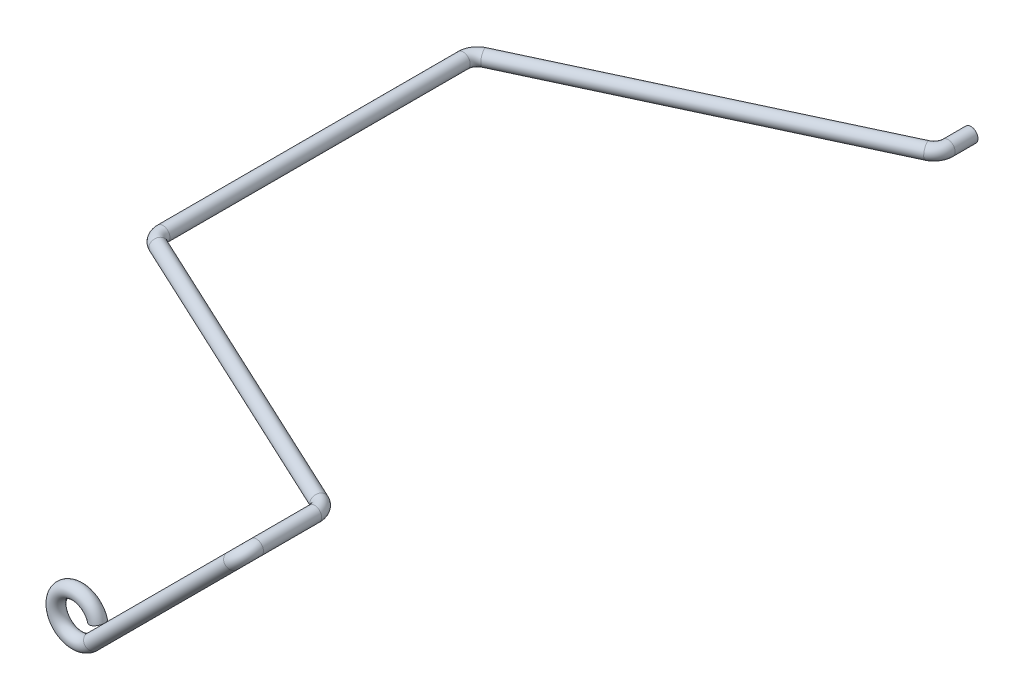
ISO-10303-21;
HEADER;
FILE_DESCRIPTION(('STEP AP214'),'2;1');
FILE_NAME('part.step','',(''),(''),'','','');
FILE_SCHEMA(('AUTOMOTIVE_DESIGN { 1 0 10303 214 1 1 1 1 }'));
ENDSEC;
DATA;
#1=APPLICATION_CONTEXT('core data for automotive mechanical design processes');
#2=APPLICATION_PROTOCOL_DEFINITION('international standard','automotive_design',2000,#1);
#3=PRODUCT_CONTEXT('',#1,'mechanical');
#4=PRODUCT('Part','Part','',(#3));
#5=PRODUCT_RELATED_PRODUCT_CATEGORY('part','',(#4));
#6=PRODUCT_DEFINITION_FORMATION('','',#4);
#7=PRODUCT_DEFINITION_CONTEXT('part definition',#1,'design');
#8=PRODUCT_DEFINITION('design','',#6,#7);
#9=PRODUCT_DEFINITION_SHAPE('','',#8);
#10=(LENGTH_UNIT() NAMED_UNIT(*) SI_UNIT(.MILLI.,.METRE.));
#11=(NAMED_UNIT(*) PLANE_ANGLE_UNIT() SI_UNIT($,.RADIAN.));
#12=(NAMED_UNIT(*) SI_UNIT($,.STERADIAN.) SOLID_ANGLE_UNIT());
#13=UNCERTAINTY_MEASURE_WITH_UNIT(LENGTH_MEASURE(1.E-05),#10,'distance_accuracy_value','');
#14=(GEOMETRIC_REPRESENTATION_CONTEXT(3) GLOBAL_UNCERTAINTY_ASSIGNED_CONTEXT((#13)) GLOBAL_UNIT_ASSIGNED_CONTEXT((#10,
#11,#12)) REPRESENTATION_CONTEXT('',''));
#15=CARTESIAN_POINT('',(0.,0.,0.));
#16=DIRECTION('',(0.,0.,1.));
#17=DIRECTION('',(1.,0.,0.));
#18=AXIS2_PLACEMENT_3D('',#15,#16,#17);
#19=CARTESIAN_POINT('',(-23.334523779156,-19.0918830920372,103.));
#20=DIRECTION('',(0.,0.,-1.));
#21=DIRECTION('',(-1.,0.,0.));
#22=AXIS2_PLACEMENT_3D('',#19,#20,#21);
#23=TOROIDAL_SURFACE('',#22,2.9999999999999,1.);
#24=CARTESIAN_POINT('',(-21.2132034355965,-21.2132034355968,103.));
#25=DIRECTION('',(-0.707106781186561,-0.707106781186534,0.));
#26=DIRECTION('',(0.49999999999999,-0.500000000000013,0.707106781186546));
#27=AXIS2_PLACEMENT_3D('',#24,#25,#26);
#28=CIRCLE('',#27,1.);
#29=CARTESIAN_POINT('',(-20.50609665441,-21.9203102167833,103.));
#30=VERTEX_POINT('',#29);
#31=EDGE_CURVE('E37',#30,#30,#28,.T.);
#32=CARTESIAN_POINT('',(-20.436746300289,-18.3154259567292,103.));
#33=DIRECTION('',(0.258819045102662,-0.96592582628903,0.));
#34=DIRECTION('',(0.683012701892195,0.183012701892317,0.707106781186546));
#35=AXIS2_PLACEMENT_3D('',#32,#33,#34);
#36=CIRCLE('',#35,1.);
#37=CARTESIAN_POINT('',(-19.470820474,-18.0566069116266,103.));
#38=VERTEX_POINT('',#37);
#39=EDGE_CURVE('E10',#38,#38,#36,.T.);
#40=CARTESIAN_POINT('',(-23.334523779156,-19.0918830920372,103.));
#41=DIRECTION('',(0.,0.,-1.));
#42=DIRECTION('',(-1.,0.,0.));
#43=AXIS2_PLACEMENT_3D('',#40,#41,#42);
#44=CIRCLE('',#43,3.9999999999999);
#45=EDGE_CURVE('',#30,#38,#44,.T.);
#46=ORIENTED_EDGE('',*,*,#31,.T.);
#47=ORIENTED_EDGE('',*,*,#39,.F.);
#48=ORIENTED_EDGE('',*,*,#45,.T.);
#49=ORIENTED_EDGE('',*,*,#45,.F.);
#50=EDGE_LOOP('',(#46,#48,#47,#49));
#51=FACE_BOUND('',#50,.T.);
#52=ADVANCED_FACE('F31',(#51),#23,.T.);
#53=CARTESIAN_POINT('',(-1.41421356237319,-1.41421356237305,103.));
#54=DIRECTION('',(-0.70710678118654,-0.707106781186555,0.));
#55=DIRECTION('',(0.707106781186555,-0.70710678118654,0.));
#56=AXIS2_PLACEMENT_3D('',#53,#54,#55);
#57=CYLINDRICAL_SURFACE('',#56,1.);
#58=CARTESIAN_POINT('',(-1.41421356237319,-1.41421356237305,103.));
#59=DIRECTION('',(-0.707106781186561,-0.707106781186534,0.));
#60=DIRECTION('',(0.49999999999999,-0.500000000000013,0.707106781186546));
#61=AXIS2_PLACEMENT_3D('',#58,#59,#60);
#62=CIRCLE('',#61,1.);
#63=CARTESIAN_POINT('',(-1.41421356237319,-1.41421356237307,104.));
#64=VERTEX_POINT('',#63);
#65=EDGE_CURVE('E41',#64,#64,#62,.T.);
#66=ORIENTED_EDGE('',*,*,#65,.T.);
#67=EDGE_LOOP('',(#66));
#68=FACE_BOUND('',#67,.T.);
#69=ORIENTED_EDGE('',*,*,#31,.F.);
#70=EDGE_LOOP('',(#69));
#71=FACE_BOUND('',#70,.T.);
#72=ADVANCED_FACE('F96',(#68,#71),#57,.T.);
#73=CARTESIAN_POINT('',(-1.41421356237318,-1.41421356237301,101.));
#74=DIRECTION('',(0.707106781186544,-0.707106781186551,0.));
#75=DIRECTION('',(0.707106781186551,0.707106781186544,0.));
#76=AXIS2_PLACEMENT_3D('',#73,#74,#75);
#77=TOROIDAL_SURFACE('',#76,2.00000000000012,1.);
#78=CARTESIAN_POINT('',(0.,1.63658069083023E-13,101.));
#79=DIRECTION('',(0.,0.,1.));
#80=DIRECTION('',(1.,0.,0.));
#81=AXIS2_PLACEMENT_3D('',#78,#79,#80);
#82=CIRCLE('',#81,1.);
#83=CARTESIAN_POINT('',(0.707106781186553,0.707106781186707,101.));
#84=VERTEX_POINT('',#83);
#85=EDGE_CURVE('E45',#84,#84,#82,.T.);
#86=CARTESIAN_POINT('',(-1.41421356237318,-1.41421356237301,101.));
#87=DIRECTION('',(0.707106781186544,-0.707106781186551,0.));
#88=DIRECTION('',(0.707106781186551,0.707106781186544,0.));
#89=AXIS2_PLACEMENT_3D('',#86,#87,#88);
#90=CIRCLE('',#89,3.00000000000012);
#91=EDGE_CURVE('',#84,#64,#90,.T.);
#92=ORIENTED_EDGE('',*,*,#85,.T.);
#93=ORIENTED_EDGE('',*,*,#65,.F.);
#94=ORIENTED_EDGE('',*,*,#91,.T.);
#95=ORIENTED_EDGE('',*,*,#91,.F.);
#96=EDGE_LOOP('',(#92,#94,#93,#95));
#97=FACE_BOUND('',#96,.T.);
#98=ADVANCED_FACE('F100',(#97),#77,.T.);
#99=CARTESIAN_POINT('',(0.,0.,92.7737260476329));
#100=DIRECTION('',(0.,0.,1.));
#101=DIRECTION('',(0.,-1.,0.));
#102=AXIS2_PLACEMENT_3D('',#99,#100,#101);
#103=CYLINDRICAL_SURFACE('',#102,1.);
#104=CARTESIAN_POINT('',(0.,0.,92.7737260476329));
#105=DIRECTION('',(0.,0.,1.));
#106=DIRECTION('',(1.,0.,0.));
#107=AXIS2_PLACEMENT_3D('',#104,#105,#106);
#108=CIRCLE('',#107,1.);
#109=CARTESIAN_POINT('',(1.,0.,92.7737260476329));
#110=VERTEX_POINT('',#109);
#111=EDGE_CURVE('E50',#110,#110,#108,.T.);
#112=ORIENTED_EDGE('',*,*,#111,.T.);
#113=EDGE_LOOP('',(#112));
#114=FACE_BOUND('',#113,.T.);
#115=ORIENTED_EDGE('',*,*,#85,.F.);
#116=EDGE_LOOP('',(#115));
#117=FACE_BOUND('',#116,.T.);
#118=ADVANCED_FACE('F106',(#114,#117),#103,.T.);
#119=CARTESIAN_POINT('',(-2.,0.,92.7737260476329));
#120=DIRECTION('',(0.,-1.,0.));
#121=DIRECTION('',(0.,0.,-1.));
#122=AXIS2_PLACEMENT_3D('',#119,#120,#121);
#123=TOROIDAL_SURFACE('',#122,2.,1.);
#124=CARTESIAN_POINT('',(-1.15422906933774,0.,90.9613597676424));
#125=DIRECTION('',(0.906183139995262,0.,0.422885465331132));
#126=DIRECTION('',(0.422885465331132,0.,-0.906183139995262));
#127=AXIS2_PLACEMENT_3D('',#124,#125,#126);
#128=CIRCLE('',#127,1.);
#129=CARTESIAN_POINT('',(-0.731343604006615,0.,90.0551766276471));
#130=VERTEX_POINT('',#129);
#131=EDGE_CURVE('E53',#130,#130,#128,.T.);
#132=CARTESIAN_POINT('',(-2.,0.,92.7737260476329));
#133=DIRECTION('',(0.,-1.,0.));
#134=DIRECTION('',(0.,0.,-1.));
#135=AXIS2_PLACEMENT_3D('',#132,#133,#134);
#136=CIRCLE('',#135,3.);
#137=EDGE_CURVE('',#130,#110,#136,.T.);
#138=ORIENTED_EDGE('',*,*,#131,.T.);
#139=ORIENTED_EDGE('',*,*,#111,.F.);
#140=ORIENTED_EDGE('',*,*,#137,.T.);
#141=ORIENTED_EDGE('',*,*,#137,.F.);
#142=EDGE_LOOP('',(#138,#140,#139,#141));
#143=FACE_BOUND('',#142,.T.);
#144=ADVANCED_FACE('F113',(#143),#123,.T.);
#145=CARTESIAN_POINT('',(-43.8457709306622,0.,71.0386402323576));
#146=DIRECTION('',(0.906183139995265,0.,0.422885465331124));
#147=DIRECTION('',(0.422885465331124,0.,-0.906183139995265));
#148=AXIS2_PLACEMENT_3D('',#145,#146,#147);
#149=CYLINDRICAL_SURFACE('',#148,1.);
#150=CARTESIAN_POINT('',(-43.8457709306622,0.,71.0386402323576));
#151=DIRECTION('',(0.906183139995262,0.,0.422885465331132));
#152=DIRECTION('',(0.422885465331132,0.,-0.906183139995262));
#153=AXIS2_PLACEMENT_3D('',#150,#151,#152);
#154=CIRCLE('',#153,1.);
#155=CARTESIAN_POINT('',(-44.2686563959934,0.,71.9448233723529));
#156=VERTEX_POINT('',#155);
#157=EDGE_CURVE('E56',#156,#156,#154,.T.);
#158=ORIENTED_EDGE('',*,*,#157,.T.);
#159=EDGE_LOOP('',(#158));
#160=FACE_BOUND('',#159,.T.);
#161=ORIENTED_EDGE('',*,*,#131,.F.);
#162=EDGE_LOOP('',(#161));
#163=FACE_BOUND('',#162,.T.);
#164=ADVANCED_FACE('F117',(#160,#163),#149,.T.);
#165=CARTESIAN_POINT('',(-43.,0.,69.2262739523671));
#166=DIRECTION('',(0.,1.,0.));
#167=DIRECTION('',(0.,0.,1.));
#168=AXIS2_PLACEMENT_3D('',#165,#166,#167);
#169=TOROIDAL_SURFACE('',#168,2.00000000000001,1.);
#170=CARTESIAN_POINT('',(-45.,0.,69.2262739523671));
#171=DIRECTION('',(0.,0.,1.));
#172=DIRECTION('',(1.,0.,0.));
#173=AXIS2_PLACEMENT_3D('',#170,#171,#172);
#174=CIRCLE('',#173,1.);
#175=CARTESIAN_POINT('',(-46.,0.,69.2262739523671));
#176=VERTEX_POINT('',#175);
#177=EDGE_CURVE('E59',#176,#176,#174,.T.);
#178=CARTESIAN_POINT('',(-43.,0.,69.2262739523671));
#179=DIRECTION('',(0.,1.,0.));
#180=DIRECTION('',(0.,0.,1.));
#181=AXIS2_PLACEMENT_3D('',#178,#179,#180);
#182=CIRCLE('',#181,3.00000000000001);
#183=EDGE_CURVE('',#176,#156,#182,.T.);
#184=ORIENTED_EDGE('',*,*,#177,.T.);
#185=ORIENTED_EDGE('',*,*,#157,.F.);
#186=ORIENTED_EDGE('',*,*,#183,.T.);
#187=ORIENTED_EDGE('',*,*,#183,.F.);
#188=EDGE_LOOP('',(#184,#186,#185,#187));
#189=FACE_BOUND('',#188,.T.);
#190=ADVANCED_FACE('F121',(#189),#169,.T.);
#191=CARTESIAN_POINT('',(-45.,0.,26.7737260476329));
#192=DIRECTION('',(0.,0.,1.));
#193=DIRECTION('',(1.,0.,0.));
#194=AXIS2_PLACEMENT_3D('',#191,#192,#193);
#195=CYLINDRICAL_SURFACE('',#194,1.);
#196=CARTESIAN_POINT('',(-45.,0.,26.7737260476329));
#197=DIRECTION('',(0.,0.,1.));
#198=DIRECTION('',(1.,0.,0.));
#199=AXIS2_PLACEMENT_3D('',#196,#197,#198);
#200=CIRCLE('',#199,1.);
#201=CARTESIAN_POINT('',(-46.,0.,26.7737260476329));
#202=VERTEX_POINT('',#201);
#203=EDGE_CURVE('E62',#202,#202,#200,.T.);
#204=ORIENTED_EDGE('',*,*,#203,.T.);
#205=EDGE_LOOP('',(#204));
#206=FACE_BOUND('',#205,.T.);
#207=ORIENTED_EDGE('',*,*,#177,.F.);
#208=EDGE_LOOP('',(#207));
#209=FACE_BOUND('',#208,.T.);
#210=ADVANCED_FACE('F125',(#206,#209),#195,.T.);
#211=CARTESIAN_POINT('',(-43.,0.,26.7737260476329));
#212=DIRECTION('',(0.,1.,0.));
#213=DIRECTION('',(0.,0.,1.));
#214=AXIS2_PLACEMENT_3D('',#211,#212,#213);
#215=TOROIDAL_SURFACE('',#214,2.,1.);
#216=CARTESIAN_POINT('',(-43.8457709306623,0.,24.9613597676424));
#217=DIRECTION('',(-0.906183139995265,0.,0.422885465331124));
#218=DIRECTION('',(0.422885465331124,0.,0.906183139995265));
#219=AXIS2_PLACEMENT_3D('',#216,#217,#218);
#220=CIRCLE('',#219,1.);
#221=CARTESIAN_POINT('',(-44.2686563959934,0.,24.0551766276471));
#222=VERTEX_POINT('',#221);
#223=EDGE_CURVE('E65',#222,#222,#220,.T.);
#224=CARTESIAN_POINT('',(-43.,0.,26.7737260476329));
#225=DIRECTION('',(0.,1.,0.));
#226=DIRECTION('',(0.,0.,1.));
#227=AXIS2_PLACEMENT_3D('',#224,#225,#226);
#228=CIRCLE('',#227,3.);
#229=EDGE_CURVE('',#222,#202,#228,.T.);
#230=ORIENTED_EDGE('',*,*,#223,.T.);
#231=ORIENTED_EDGE('',*,*,#203,.F.);
#232=ORIENTED_EDGE('',*,*,#229,.T.);
#233=ORIENTED_EDGE('',*,*,#229,.F.);
#234=EDGE_LOOP('',(#230,#232,#231,#233));
#235=FACE_BOUND('',#234,.T.);
#236=ADVANCED_FACE('F129',(#235),#215,.T.);
#237=CARTESIAN_POINT('',(-1.15422906933775,0.,5.03864023235763));
#238=DIRECTION('',(-0.906183139995266,0.,0.422885465331124));
#239=DIRECTION('',(0.422885465331124,0.,0.906183139995266));
#240=AXIS2_PLACEMENT_3D('',#237,#238,#239);
#241=CYLINDRICAL_SURFACE('',#240,1.);
#242=CARTESIAN_POINT('',(-1.15422906933775,0.,5.03864023235763));
#243=DIRECTION('',(-0.906183139995265,0.,0.422885465331124));
#244=DIRECTION('',(0.422885465331124,0.,0.906183139995265));
#245=AXIS2_PLACEMENT_3D('',#242,#243,#244);
#246=CIRCLE('',#245,1.);
#247=CARTESIAN_POINT('',(-0.731343604006628,0.,5.9448233723529));
#248=VERTEX_POINT('',#247);
#249=EDGE_CURVE('E68',#248,#248,#246,.T.);
#250=ORIENTED_EDGE('',*,*,#249,.T.);
#251=EDGE_LOOP('',(#250));
#252=FACE_BOUND('',#251,.T.);
#253=ORIENTED_EDGE('',*,*,#223,.F.);
#254=EDGE_LOOP('',(#253));
#255=FACE_BOUND('',#254,.T.);
#256=ADVANCED_FACE('F133',(#252,#255),#241,.T.);
#257=CARTESIAN_POINT('',(-2.,0.,3.2262739523671));
#258=DIRECTION('',(0.,-1.,0.));
#259=DIRECTION('',(0.,0.,-1.));
#260=AXIS2_PLACEMENT_3D('',#257,#258,#259);
#261=TOROIDAL_SURFACE('',#260,2.,1.);
#262=CARTESIAN_POINT('',(0.,0.,3.2262739523671));
#263=DIRECTION('',(0.,0.,1.));
#264=DIRECTION('',(1.,0.,0.));
#265=AXIS2_PLACEMENT_3D('',#262,#263,#264);
#266=CIRCLE('',#265,1.);
#267=CARTESIAN_POINT('',(1.,0.,3.2262739523671));
#268=VERTEX_POINT('',#267);
#269=EDGE_CURVE('E71',#268,#268,#266,.T.);
#270=CARTESIAN_POINT('',(-2.,0.,3.2262739523671));
#271=DIRECTION('',(0.,-1.,0.));
#272=DIRECTION('',(0.,0.,-1.));
#273=AXIS2_PLACEMENT_3D('',#270,#271,#272);
#274=CIRCLE('',#273,3.);
#275=EDGE_CURVE('',#268,#248,#274,.T.);
#276=ORIENTED_EDGE('',*,*,#269,.T.);
#277=ORIENTED_EDGE('',*,*,#249,.F.);
#278=ORIENTED_EDGE('',*,*,#275,.T.);
#279=ORIENTED_EDGE('',*,*,#275,.F.);
#280=EDGE_LOOP('',(#276,#278,#277,#279));
#281=FACE_BOUND('',#280,.T.);
#282=ADVANCED_FACE('F78',(#281),#261,.T.);
#283=CARTESIAN_POINT('',(0.,0.,3.2262739523671));
#284=DIRECTION('',(0.,0.,-1.));
#285=DIRECTION('',(0.,1.,0.));
#286=AXIS2_PLACEMENT_3D('',#283,#284,#285);
#287=CYLINDRICAL_SURFACE('',#286,1.);
#288=ORIENTED_EDGE('',*,*,#269,.F.);
#289=EDGE_LOOP('',(#288));
#290=FACE_BOUND('',#289,.T.);
#291=CARTESIAN_POINT('',(0.,0.,0.));
#292=DIRECTION('',(0.,0.,1.));
#293=DIRECTION('',(1.,0.,0.));
#294=AXIS2_PLACEMENT_3D('',#291,#292,#293);
#295=CIRCLE('',#294,1.);
#296=CARTESIAN_POINT('',(1.,0.,0.));
#297=VERTEX_POINT('',#296);
#298=EDGE_CURVE('E72',#297,#297,#295,.T.);
#299=ORIENTED_EDGE('',*,*,#298,.T.);
#300=EDGE_LOOP('',(#299));
#301=FACE_BOUND('',#300,.T.);
#302=ADVANCED_FACE('F81',(#290,#301),#287,.T.);
#303=CARTESIAN_POINT('',(-20.436746300289,-18.3154259567292,103.));
#304=DIRECTION('',(0.258819045102662,-0.96592582628903,0.));
#305=DIRECTION('',(0.683012701892195,0.183012701892317,0.707106781186546));
#306=AXIS2_PLACEMENT_3D('',#303,#304,#305);
#307=PLANE('',#306);
#308=ORIENTED_EDGE('',*,*,#39,.T.);
#309=EDGE_LOOP('',(#308));
#310=FACE_BOUND('',#309,.T.);
#311=ADVANCED_FACE('F84',(#310),#307,.T.);
#312=CARTESIAN_POINT('',(0.,0.,0.));
#313=DIRECTION('',(0.,0.,1.));
#314=DIRECTION('',(1.,0.,0.));
#315=AXIS2_PLACEMENT_3D('',#312,#313,#314);
#316=PLANE('',#315);
#317=ORIENTED_EDGE('',*,*,#298,.F.);
#318=EDGE_LOOP('',(#317));
#319=FACE_BOUND('',#318,.T.);
#320=ADVANCED_FACE('F88',(#319),#316,.F.);
#321=CLOSED_SHELL('',(#52,#72,#98,#118,#144,#164,#190,#210,#236,#256,#282,#302,#311,#320));
#322=MANIFOLD_SOLID_BREP('B2',#321);
#323=ADVANCED_BREP_SHAPE_REPRESENTATION('',(#18,#322),#14);
#324=SHAPE_DEFINITION_REPRESENTATION(#9,#323);
ENDSEC;
END-ISO-10303-21;
